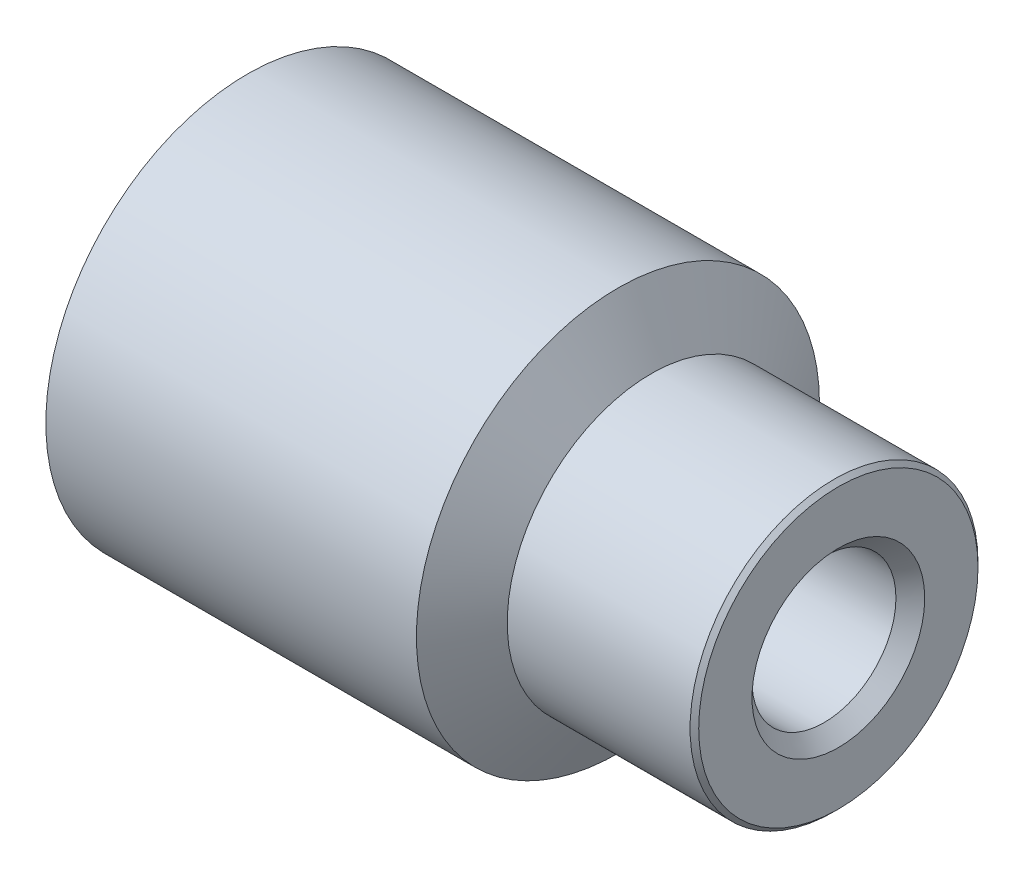
ISO-10303-21;
HEADER;
FILE_DESCRIPTION(('STEP AP214'),'2;1');
FILE_NAME('part.step','',(''),(''),'','','');
FILE_SCHEMA(('AUTOMOTIVE_DESIGN { 1 0 10303 214 1 1 1 1 }'));
ENDSEC;
DATA;
#1=APPLICATION_CONTEXT('core data for automotive mechanical design processes');
#2=APPLICATION_PROTOCOL_DEFINITION('international standard','automotive_design',2000,#1);
#3=PRODUCT_CONTEXT('',#1,'mechanical');
#4=PRODUCT('Part','Part','',(#3));
#5=PRODUCT_RELATED_PRODUCT_CATEGORY('part','',(#4));
#6=PRODUCT_DEFINITION_FORMATION('','',#4);
#7=PRODUCT_DEFINITION_CONTEXT('part definition',#1,'design');
#8=PRODUCT_DEFINITION('design','',#6,#7);
#9=PRODUCT_DEFINITION_SHAPE('','',#8);
#10=(LENGTH_UNIT() NAMED_UNIT(*) SI_UNIT(.MILLI.,.METRE.));
#11=(NAMED_UNIT(*) PLANE_ANGLE_UNIT() SI_UNIT($,.RADIAN.));
#12=(NAMED_UNIT(*) SI_UNIT($,.STERADIAN.) SOLID_ANGLE_UNIT());
#13=UNCERTAINTY_MEASURE_WITH_UNIT(LENGTH_MEASURE(1.E-05),#10,'distance_accuracy_value','');
#14=(GEOMETRIC_REPRESENTATION_CONTEXT(3) GLOBAL_UNCERTAINTY_ASSIGNED_CONTEXT((#13)) GLOBAL_UNIT_ASSIGNED_CONTEXT((#10,
#11,#12)) REPRESENTATION_CONTEXT('',''));
#15=CARTESIAN_POINT('',(0.,0.,0.));
#16=DIRECTION('',(0.,0.,1.));
#17=DIRECTION('',(1.,0.,0.));
#18=AXIS2_PLACEMENT_3D('',#15,#16,#17);
#19=CARTESIAN_POINT('',(0.,0.,0.));
#20=DIRECTION('',(1.,0.,0.));
#21=DIRECTION('',(0.,0.,-1.));
#22=AXIS2_PLACEMENT_3D('',#19,#20,#21);
#23=PLANE('',#22);
#24=CARTESIAN_POINT('',(0.,0.,0.));
#25=DIRECTION('',(1.,0.,0.));
#26=DIRECTION('',(0.,0.,-1.));
#27=AXIS2_PLACEMENT_3D('',#24,#25,#26);
#28=CIRCLE('',#27,10.625);
#29=CARTESIAN_POINT('',(0.,0.,-10.625));
#30=VERTEX_POINT('',#29);
#31=EDGE_CURVE('E60',#30,#30,#28,.T.);
#32=ORIENTED_EDGE('',*,*,#31,.F.);
#33=EDGE_LOOP('',(#32));
#34=FACE_BOUND('',#33,.T.);
#35=CARTESIAN_POINT('',(0.,0.,0.));
#36=DIRECTION('',(1.,0.,0.));
#37=DIRECTION('',(0.,0.,-1.));
#38=AXIS2_PLACEMENT_3D('',#35,#36,#37);
#39=CIRCLE('',#38,6.);
#40=CARTESIAN_POINT('',(0.,0.,-6.));
#41=VERTEX_POINT('',#40);
#42=EDGE_CURVE('E56',#41,#41,#39,.T.);
#43=ORIENTED_EDGE('',*,*,#42,.T.);
#44=EDGE_LOOP('',(#43));
#45=FACE_BOUND('',#44,.T.);
#46=ADVANCED_FACE('F15',(#34,#45),#23,.F.);
#47=CARTESIAN_POINT('',(0.,0.,0.));
#48=DIRECTION('',(1.,0.,0.));
#49=DIRECTION('',(0.,0.,-1.));
#50=AXIS2_PLACEMENT_3D('',#47,#48,#49);
#51=CONICAL_SURFACE('',#50,10.625,1.0471975511966);
#52=CARTESIAN_POINT('',(1.94855715851501,0.,0.));
#53=DIRECTION('',(1.,0.,0.));
#54=DIRECTION('',(0.,0.,-1.));
#55=AXIS2_PLACEMENT_3D('',#52,#53,#54);
#56=CIRCLE('',#55,14.);
#57=CARTESIAN_POINT('',(1.94855715851501,0.,-14.));
#58=VERTEX_POINT('',#57);
#59=EDGE_CURVE('E52',#58,#58,#56,.T.);
#60=ORIENTED_EDGE('',*,*,#59,.F.);
#61=EDGE_LOOP('',(#60));
#62=FACE_BOUND('',#61,.T.);
#63=ORIENTED_EDGE('',*,*,#31,.T.);
#64=EDGE_LOOP('',(#63));
#65=FACE_BOUND('',#64,.T.);
#66=ADVANCED_FACE('F65',(#62,#65),#51,.T.);
#67=CARTESIAN_POINT('',(0.,0.,0.));
#68=DIRECTION('',(-1.,0.,0.));
#69=DIRECTION('',(0.,0.,1.));
#70=AXIS2_PLACEMENT_3D('',#67,#68,#69);
#71=CONICAL_SURFACE('',#70,6.,0.785398163397448);
#72=CARTESIAN_POINT('',(1.,0.,0.));
#73=DIRECTION('',(1.,0.,0.));
#74=DIRECTION('',(0.,0.,-1.));
#75=AXIS2_PLACEMENT_3D('',#72,#73,#74);
#76=CIRCLE('',#75,5.);
#77=CARTESIAN_POINT('',(1.,0.,-5.));
#78=VERTEX_POINT('',#77);
#79=EDGE_CURVE('E48',#78,#78,#76,.T.);
#80=ORIENTED_EDGE('',*,*,#79,.T.);
#81=EDGE_LOOP('',(#80));
#82=FACE_BOUND('',#81,.T.);
#83=ORIENTED_EDGE('',*,*,#42,.F.);
#84=EDGE_LOOP('',(#83));
#85=FACE_BOUND('',#84,.T.);
#86=ADVANCED_FACE('F72',(#82,#85),#71,.F.);
#87=CARTESIAN_POINT('',(43.,0.,0.));
#88=DIRECTION('',(1.,0.,0.));
#89=DIRECTION('',(0.,0.,-1.));
#90=AXIS2_PLACEMENT_3D('',#87,#88,#89);
#91=CYLINDRICAL_SURFACE('',#90,14.);
#92=CARTESIAN_POINT('',(27.690598923241,0.,0.));
#93=DIRECTION('',(1.,0.,0.));
#94=DIRECTION('',(0.,0.,-1.));
#95=AXIS2_PLACEMENT_3D('',#92,#93,#94);
#96=CIRCLE('',#95,14.);
#97=CARTESIAN_POINT('',(27.690598923241,0.,-14.));
#98=VERTEX_POINT('',#97);
#99=EDGE_CURVE('E44',#98,#98,#96,.T.);
#100=ORIENTED_EDGE('',*,*,#99,.F.);
#101=EDGE_LOOP('',(#100));
#102=FACE_BOUND('',#101,.T.);
#103=ORIENTED_EDGE('',*,*,#59,.T.);
#104=EDGE_LOOP('',(#103));
#105=FACE_BOUND('',#104,.T.);
#106=ADVANCED_FACE('F74',(#102,#105),#91,.T.);
#107=CARTESIAN_POINT('',(43.,0.,0.));
#108=DIRECTION('',(1.,0.,0.));
#109=DIRECTION('',(0.,0.,-1.));
#110=AXIS2_PLACEMENT_3D('',#107,#108,#109);
#111=CYLINDRICAL_SURFACE('',#110,5.);
#112=CARTESIAN_POINT('',(42.,0.,0.));
#113=DIRECTION('',(1.,0.,0.));
#114=DIRECTION('',(0.,0.,-1.));
#115=AXIS2_PLACEMENT_3D('',#112,#113,#114);
#116=CIRCLE('',#115,5.);
#117=CARTESIAN_POINT('',(42.,0.,-5.));
#118=VERTEX_POINT('',#117);
#119=EDGE_CURVE('E41',#118,#118,#116,.T.);
#120=ORIENTED_EDGE('',*,*,#119,.T.);
#121=EDGE_LOOP('',(#120));
#122=FACE_BOUND('',#121,.T.);
#123=ORIENTED_EDGE('',*,*,#79,.F.);
#124=EDGE_LOOP('',(#123));
#125=FACE_BOUND('',#124,.T.);
#126=ADVANCED_FACE('F81',(#122,#125),#111,.F.);
#127=CARTESIAN_POINT('',(27.690598923241,0.,0.));
#128=DIRECTION('',(-1.,0.,0.));
#129=DIRECTION('',(0.,0.,1.));
#130=AXIS2_PLACEMENT_3D('',#127,#128,#129);
#131=CONICAL_SURFACE('',#130,14.,1.0471975511965);
#132=CARTESIAN_POINT('',(30.,0.,0.));
#133=DIRECTION('',(1.,0.,0.));
#134=DIRECTION('',(0.,0.,-1.));
#135=AXIS2_PLACEMENT_3D('',#132,#133,#134);
#136=CIRCLE('',#135,10.);
#137=CARTESIAN_POINT('',(30.,0.,-10.));
#138=VERTEX_POINT('',#137);
#139=EDGE_CURVE('E35',#138,#138,#136,.T.);
#140=ORIENTED_EDGE('',*,*,#139,.F.);
#141=EDGE_LOOP('',(#140));
#142=FACE_BOUND('',#141,.T.);
#143=ORIENTED_EDGE('',*,*,#99,.T.);
#144=EDGE_LOOP('',(#143));
#145=FACE_BOUND('',#144,.T.);
#146=ADVANCED_FACE('F89',(#142,#145),#131,.T.);
#147=CARTESIAN_POINT('',(42.,0.,0.));
#148=DIRECTION('',(1.,0.,0.));
#149=DIRECTION('',(0.,0.,-1.));
#150=AXIS2_PLACEMENT_3D('',#147,#148,#149);
#151=CONICAL_SURFACE('',#150,5.,0.785398163397448);
#152=CARTESIAN_POINT('',(43.,0.,0.));
#153=DIRECTION('',(1.,0.,0.));
#154=DIRECTION('',(0.,0.,-1.));
#155=AXIS2_PLACEMENT_3D('',#152,#153,#154);
#156=CIRCLE('',#155,6.);
#157=CARTESIAN_POINT('',(43.,0.,-6.));
#158=VERTEX_POINT('',#157);
#159=EDGE_CURVE('E30',#158,#158,#156,.T.);
#160=ORIENTED_EDGE('',*,*,#159,.T.);
#161=EDGE_LOOP('',(#160));
#162=FACE_BOUND('',#161,.T.);
#163=ORIENTED_EDGE('',*,*,#119,.F.);
#164=EDGE_LOOP('',(#163));
#165=FACE_BOUND('',#164,.T.);
#166=ADVANCED_FACE('F93',(#162,#165),#151,.F.);
#167=CARTESIAN_POINT('',(43.,0.,0.));
#168=DIRECTION('',(1.,0.,0.));
#169=DIRECTION('',(0.,0.,-1.));
#170=AXIS2_PLACEMENT_3D('',#167,#168,#169);
#171=CYLINDRICAL_SURFACE('',#170,10.);
#172=CARTESIAN_POINT('',(42.7,0.,0.));
#173=DIRECTION('',(1.,0.,0.));
#174=DIRECTION('',(0.,0.,-1.));
#175=AXIS2_PLACEMENT_3D('',#172,#173,#174);
#176=CIRCLE('',#175,10.);
#177=CARTESIAN_POINT('',(42.7,0.,-10.));
#178=VERTEX_POINT('',#177);
#179=EDGE_CURVE('E23',#178,#178,#176,.T.);
#180=ORIENTED_EDGE('',*,*,#179,.F.);
#181=EDGE_LOOP('',(#180));
#182=FACE_BOUND('',#181,.T.);
#183=ORIENTED_EDGE('',*,*,#139,.T.);
#184=EDGE_LOOP('',(#183));
#185=FACE_BOUND('',#184,.T.);
#186=ADVANCED_FACE('F97',(#182,#185),#171,.T.);
#187=CARTESIAN_POINT('',(43.,9.7,0.));
#188=DIRECTION('',(-1.,0.,0.));
#189=DIRECTION('',(0.,0.,1.));
#190=AXIS2_PLACEMENT_3D('',#187,#188,#189);
#191=PLANE('',#190);
#192=ORIENTED_EDGE('',*,*,#159,.F.);
#193=EDGE_LOOP('',(#192));
#194=FACE_BOUND('',#193,.T.);
#195=CARTESIAN_POINT('',(43.,0.,0.));
#196=DIRECTION('',(1.,0.,0.));
#197=DIRECTION('',(0.,0.,-1.));
#198=AXIS2_PLACEMENT_3D('',#195,#196,#197);
#199=CIRCLE('',#198,9.7);
#200=CARTESIAN_POINT('',(43.,0.,-9.7));
#201=VERTEX_POINT('',#200);
#202=EDGE_CURVE('E10',#201,#201,#199,.T.);
#203=ORIENTED_EDGE('',*,*,#202,.T.);
#204=EDGE_LOOP('',(#203));
#205=FACE_BOUND('',#204,.T.);
#206=ADVANCED_FACE('F100',(#194,#205),#191,.F.);
#207=CARTESIAN_POINT('',(42.7,0.,0.));
#208=DIRECTION('',(-1.,0.,0.));
#209=DIRECTION('',(0.,0.,1.));
#210=AXIS2_PLACEMENT_3D('',#207,#208,#209);
#211=CONICAL_SURFACE('',#210,10.,0.785398163397445);
#212=ORIENTED_EDGE('',*,*,#202,.F.);
#213=EDGE_LOOP('',(#212));
#214=FACE_BOUND('',#213,.T.);
#215=ORIENTED_EDGE('',*,*,#179,.T.);
#216=EDGE_LOOP('',(#215));
#217=FACE_BOUND('',#216,.T.);
#218=ADVANCED_FACE('F17',(#214,#217),#211,.T.);
#219=CLOSED_SHELL('',(#46,#66,#86,#106,#126,#146,#166,#186,#206,#218));
#220=MANIFOLD_SOLID_BREP('B1',#219);
#221=ADVANCED_BREP_SHAPE_REPRESENTATION('',(#18,#220),#14);
#222=SHAPE_DEFINITION_REPRESENTATION(#9,#221);
ENDSEC;
END-ISO-10303-21;
